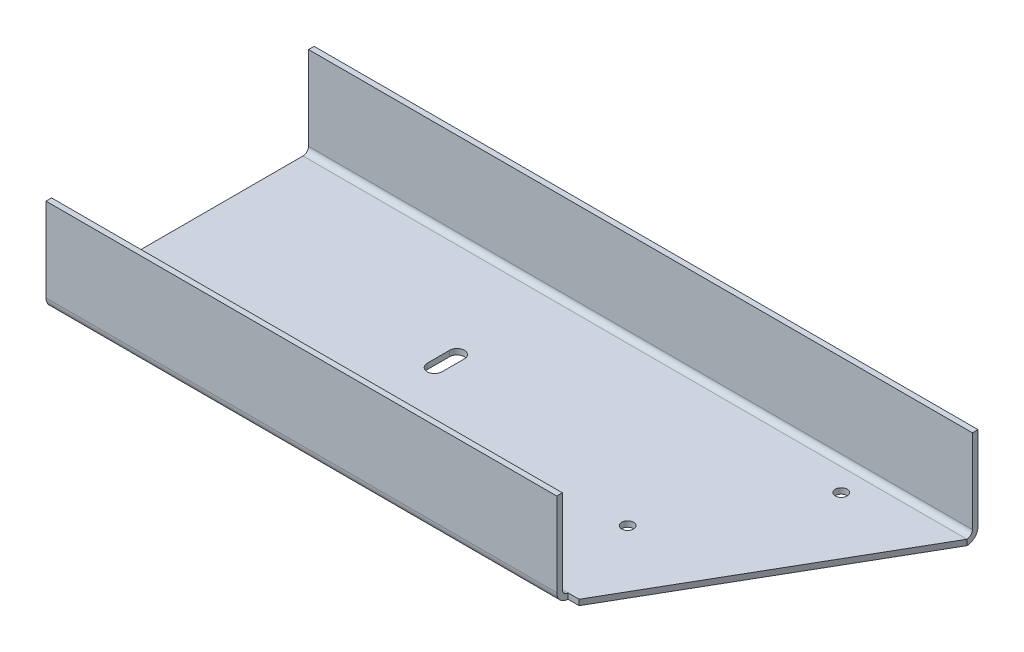
ISO-10303-21;
HEADER;
FILE_DESCRIPTION(('STEP AP214'),'2;1');
FILE_NAME('part.step','',(''),(''),'','','');
FILE_SCHEMA(('AUTOMOTIVE_DESIGN { 1 0 10303 214 1 1 1 1 }'));
ENDSEC;
DATA;
#1=APPLICATION_CONTEXT('core data for automotive mechanical design processes');
#2=APPLICATION_PROTOCOL_DEFINITION('international standard','automotive_design',2000,#1);
#3=PRODUCT_CONTEXT('',#1,'mechanical');
#4=PRODUCT('Part','Part','',(#3));
#5=PRODUCT_RELATED_PRODUCT_CATEGORY('part','',(#4));
#6=PRODUCT_DEFINITION_FORMATION('','',#4);
#7=PRODUCT_DEFINITION_CONTEXT('part definition',#1,'design');
#8=PRODUCT_DEFINITION('design','',#6,#7);
#9=PRODUCT_DEFINITION_SHAPE('','',#8);
#10=(LENGTH_UNIT() NAMED_UNIT(*) SI_UNIT(.MILLI.,.METRE.));
#11=(NAMED_UNIT(*) PLANE_ANGLE_UNIT() SI_UNIT($,.RADIAN.));
#12=(NAMED_UNIT(*) SI_UNIT($,.STERADIAN.) SOLID_ANGLE_UNIT());
#13=UNCERTAINTY_MEASURE_WITH_UNIT(LENGTH_MEASURE(1.E-05),#10,'distance_accuracy_value','');
#14=(GEOMETRIC_REPRESENTATION_CONTEXT(3) GLOBAL_UNCERTAINTY_ASSIGNED_CONTEXT((#13)) GLOBAL_UNIT_ASSIGNED_CONTEXT((#10,
#11,#12)) REPRESENTATION_CONTEXT('',''));
#15=CARTESIAN_POINT('',(0.,0.,0.));
#16=DIRECTION('',(0.,0.,1.));
#17=DIRECTION('',(1.,0.,0.));
#18=AXIS2_PLACEMENT_3D('',#15,#16,#17);
#19=CARTESIAN_POINT('',(733.234841870792,6.35,0.));
#20=DIRECTION('',(0.,0.,1.));
#21=DIRECTION('',(1.,0.,0.));
#22=AXIS2_PLACEMENT_3D('',#19,#20,#21);
#23=PLANE('',#22);
#24=DIRECTION('',(0.,1.,0.));
#25=VECTOR('',#24,1.);
#26=CARTESIAN_POINT('',(355.901016080212,30.1625,0.));
#27=LINE('',#26,#25);
#28=CARTESIAN_POINT('',(355.901016080212,53.975,0.));
#29=VERTEX_POINT('',#28);
#30=CARTESIAN_POINT('',(355.901016080212,6.35,0.));
#31=VERTEX_POINT('',#30);
#32=EDGE_CURVE('E284',#29,#31,#27,.F.);
#33=ORIENTED_EDGE('',*,*,#32,.F.);
#34=DIRECTION('',(1.,0.,0.));
#35=VECTOR('',#34,1.);
#36=CARTESIAN_POINT('',(544.567928975502,53.975,0.));
#37=LINE('',#36,#35);
#38=CARTESIAN_POINT('',(733.234841870792,53.975,0.));
#39=VERTEX_POINT('',#38);
#40=EDGE_CURVE('E148',#29,#39,#37,.T.);
#41=ORIENTED_EDGE('',*,*,#40,.T.);
#42=DIRECTION('',(0.,1.,0.));
#43=VECTOR('',#42,1.);
#44=CARTESIAN_POINT('',(733.234841870792,30.1625,0.));
#45=LINE('',#44,#43);
#46=CARTESIAN_POINT('',(733.234841870792,6.35,0.));
#47=VERTEX_POINT('',#46);
#48=EDGE_CURVE('E274',#39,#47,#45,.F.);
#49=ORIENTED_EDGE('',*,*,#48,.T.);
#50=DIRECTION('',(-1.,0.,0.));
#51=VECTOR('',#50,1.);
#52=CARTESIAN_POINT('',(733.234841870792,6.35,0.));
#53=LINE('',#52,#51);
#54=EDGE_CURVE('E273',#31,#47,#53,.F.);
#55=ORIENTED_EDGE('',*,*,#54,.F.);
#56=EDGE_LOOP('',(#33,#41,#49,#55));
#57=FACE_BOUND('',#56,.T.);
#58=ADVANCED_FACE('F17',(#57),#23,.F.);
#59=CARTESIAN_POINT('',(355.901016080212,6.35,152.4));
#60=DIRECTION('',(0.,0.,-1.));
#61=DIRECTION('',(-1.,0.,0.));
#62=AXIS2_PLACEMENT_3D('',#59,#60,#61);
#63=PLANE('',#62);
#64=DIRECTION('',(0.,1.,0.));
#65=VECTOR('',#64,1.);
#66=CARTESIAN_POINT('',(646.229009265076,30.1625,152.4));
#67=LINE('',#66,#65);
#68=CARTESIAN_POINT('',(646.229009265076,53.975,152.4));
#69=VERTEX_POINT('',#68);
#70=CARTESIAN_POINT('',(646.229009265076,6.35,152.4));
#71=VERTEX_POINT('',#70);
#72=EDGE_CURVE('E169',#69,#71,#67,.F.);
#73=ORIENTED_EDGE('',*,*,#72,.F.);
#74=DIRECTION('',(1.,0.,0.));
#75=VECTOR('',#74,1.);
#76=CARTESIAN_POINT('',(501.065012672644,53.975,152.4));
#77=LINE('',#76,#75);
#78=CARTESIAN_POINT('',(355.901016080212,53.975,152.4));
#79=VERTEX_POINT('',#78);
#80=EDGE_CURVE('E158',#69,#79,#77,.F.);
#81=ORIENTED_EDGE('',*,*,#80,.T.);
#82=DIRECTION('',(0.,1.,0.));
#83=VECTOR('',#82,1.);
#84=CARTESIAN_POINT('',(355.901016080212,30.1625,152.4));
#85=LINE('',#84,#83);
#86=CARTESIAN_POINT('',(355.901016080212,6.35,152.4));
#87=VERTEX_POINT('',#86);
#88=EDGE_CURVE('E138',#79,#87,#85,.F.);
#89=ORIENTED_EDGE('',*,*,#88,.T.);
#90=DIRECTION('',(1.,0.,0.));
#91=VECTOR('',#90,1.);
#92=CARTESIAN_POINT('',(355.901016080212,6.35,152.4));
#93=LINE('',#92,#91);
#94=EDGE_CURVE('E171',#71,#87,#93,.F.);
#95=ORIENTED_EDGE('',*,*,#94,.F.);
#96=EDGE_LOOP('',(#73,#81,#89,#95));
#97=FACE_BOUND('',#96,.T.);
#98=ADVANCED_FACE('F170',(#97),#63,.F.);
#99=CARTESIAN_POINT('',(501.065012672644,53.975,150.8125));
#100=DIRECTION('',(0.,-1.,0.));
#101=DIRECTION('',(0.,0.,-1.));
#102=AXIS2_PLACEMENT_3D('',#99,#100,#101);
#103=PLANE('',#102);
#104=DIRECTION('',(-1.,0.,0.));
#105=VECTOR('',#104,1.);
#106=CARTESIAN_POINT('',(355.901016080212,53.975,149.225));
#107=LINE('',#106,#105);
#108=CARTESIAN_POINT('',(355.901016080212,53.975,149.225));
#109=VERTEX_POINT('',#108);
#110=CARTESIAN_POINT('',(646.229009265076,53.975,149.225));
#111=VERTEX_POINT('',#110);
#112=EDGE_CURVE('E261',#109,#111,#107,.F.);
#113=ORIENTED_EDGE('',*,*,#112,.F.);
#114=DIRECTION('',(0.,0.,-1.));
#115=VECTOR('',#114,1.);
#116=CARTESIAN_POINT('',(355.901016080212,53.975,150.8125));
#117=LINE('',#116,#115);
#118=EDGE_CURVE('E166',#109,#79,#117,.F.);
#119=ORIENTED_EDGE('',*,*,#118,.T.);
#120=ORIENTED_EDGE('',*,*,#80,.F.);
#121=DIRECTION('',(0.,0.,-1.));
#122=VECTOR('',#121,1.);
#123=CARTESIAN_POINT('',(646.229009265076,53.975,150.8125));
#124=LINE('',#123,#122);
#125=EDGE_CURVE('E163',#111,#69,#124,.F.);
#126=ORIENTED_EDGE('',*,*,#125,.F.);
#127=EDGE_LOOP('',(#113,#119,#120,#126));
#128=FACE_BOUND('',#127,.T.);
#129=ADVANCED_FACE('F161',(#128),#103,.F.);
#130=CARTESIAN_POINT('',(544.567928975502,53.975,1.5875));
#131=DIRECTION('',(0.,-1.,0.));
#132=DIRECTION('',(0.,0.,-1.));
#133=AXIS2_PLACEMENT_3D('',#130,#131,#132);
#134=PLANE('',#133);
#135=DIRECTION('',(1.,0.,0.));
#136=VECTOR('',#135,1.);
#137=CARTESIAN_POINT('',(733.234841870792,53.975,3.175));
#138=LINE('',#137,#136);
#139=CARTESIAN_POINT('',(733.234841870792,53.975,3.175));
#140=VERTEX_POINT('',#139);
#141=CARTESIAN_POINT('',(355.901016080212,53.975,3.175));
#142=VERTEX_POINT('',#141);
#143=EDGE_CURVE('E252',#140,#142,#138,.F.);
#144=ORIENTED_EDGE('',*,*,#143,.F.);
#145=DIRECTION('',(0.,0.,1.));
#146=VECTOR('',#145,1.);
#147=CARTESIAN_POINT('',(733.234841870792,53.975,1.5875));
#148=LINE('',#147,#146);
#149=EDGE_CURVE('E271',#140,#39,#148,.F.);
#150=ORIENTED_EDGE('',*,*,#149,.T.);
#151=ORIENTED_EDGE('',*,*,#40,.F.);
#152=DIRECTION('',(0.,0.,1.));
#153=VECTOR('',#152,1.);
#154=CARTESIAN_POINT('',(355.901016080212,53.975,1.5875));
#155=LINE('',#154,#153);
#156=EDGE_CURVE('E192',#142,#29,#155,.F.);
#157=ORIENTED_EDGE('',*,*,#156,.F.);
#158=EDGE_LOOP('',(#144,#150,#151,#157));
#159=FACE_BOUND('',#158,.T.);
#160=ADVANCED_FACE('F637',(#159),#134,.F.);
#161=CARTESIAN_POINT('',(733.234841870792,6.35,6.35));
#162=DIRECTION('',(-1.,0.,0.));
#163=DIRECTION('',(0.,0.,1.));
#164=AXIS2_PLACEMENT_3D('',#161,#162,#163);
#165=CYLINDRICAL_SURFACE('',#164,6.35);
#166=ORIENTED_EDGE('',*,*,#54,.T.);
#167=CARTESIAN_POINT('',(733.234841870792,6.35,6.35));
#168=DIRECTION('',(-1.,0.,0.));
#169=DIRECTION('',(0.,0.,1.));
#170=AXIS2_PLACEMENT_3D('',#167,#168,#169);
#171=CIRCLE('',#170,6.35);
#172=CARTESIAN_POINT('',(733.234841870826,0.,6.35000000002225));
#173=VERTEX_POINT('',#172);
#174=EDGE_CURVE('E253',#47,#173,#171,.T.);
#175=ORIENTED_EDGE('',*,*,#174,.T.);
#176=DIRECTION('',(1.,0.,0.));
#177=VECTOR('',#176,1.);
#178=CARTESIAN_POINT('',(0.,0.,6.35000000000762));
#179=LINE('',#178,#177);
#180=CARTESIAN_POINT('',(355.901016080212,0.,6.35000000000381));
#181=VERTEX_POINT('',#180);
#182=EDGE_CURVE('E314',#173,#181,#179,.F.);
#183=ORIENTED_EDGE('',*,*,#182,.T.);
#184=CARTESIAN_POINT('',(355.901016080212,6.35,6.35));
#185=DIRECTION('',(-1.,0.,0.));
#186=DIRECTION('',(0.,0.,1.));
#187=AXIS2_PLACEMENT_3D('',#184,#185,#186);
#188=CIRCLE('',#187,6.35);
#189=EDGE_CURVE('E249',#31,#181,#188,.T.);
#190=ORIENTED_EDGE('',*,*,#189,.F.);
#191=EDGE_LOOP('',(#166,#175,#183,#190));
#192=FACE_BOUND('',#191,.T.);
#193=ADVANCED_FACE('F319',(#192),#165,.T.);
#194=CARTESIAN_POINT('',(355.901016080212,6.35,146.05));
#195=DIRECTION('',(1.,0.,0.));
#196=DIRECTION('',(0.,0.,-1.));
#197=AXIS2_PLACEMENT_3D('',#194,#195,#196);
#198=CYLINDRICAL_SURFACE('',#197,6.35);
#199=ORIENTED_EDGE('',*,*,#94,.T.);
#200=CARTESIAN_POINT('',(355.901016080212,6.35,146.05));
#201=DIRECTION('',(1.,0.,0.));
#202=DIRECTION('',(0.,0.,-1.));
#203=AXIS2_PLACEMENT_3D('',#200,#201,#202);
#204=CIRCLE('',#203,6.35);
#205=CARTESIAN_POINT('',(355.901016080212,0.,146.05));
#206=VERTEX_POINT('',#205);
#207=EDGE_CURVE('E20',#87,#206,#204,.T.);
#208=ORIENTED_EDGE('',*,*,#207,.T.);
#209=DIRECTION('',(1.,0.,0.));
#210=VECTOR('',#209,1.);
#211=CARTESIAN_POINT('',(0.,0.,146.05));
#212=LINE('',#211,#210);
#213=CARTESIAN_POINT('',(646.229009265076,0.,146.05));
#214=VERTEX_POINT('',#213);
#215=EDGE_CURVE('E270',#206,#214,#212,.T.);
#216=ORIENTED_EDGE('',*,*,#215,.T.);
#217=CARTESIAN_POINT('',(646.229009265076,6.35,146.05));
#218=DIRECTION('',(1.,0.,0.));
#219=DIRECTION('',(0.,0.,-1.));
#220=AXIS2_PLACEMENT_3D('',#217,#218,#219);
#221=CIRCLE('',#220,6.35);
#222=EDGE_CURVE('E254',#71,#214,#221,.T.);
#223=ORIENTED_EDGE('',*,*,#222,.F.);
#224=EDGE_LOOP('',(#199,#208,#216,#223));
#225=FACE_BOUND('',#224,.T.);
#226=ADVANCED_FACE('F304',(#225),#198,.T.);
#227=CARTESIAN_POINT('',(355.901016080212,6.35,149.225));
#228=DIRECTION('',(0.,0.,-1.));
#229=DIRECTION('',(-1.,0.,0.));
#230=AXIS2_PLACEMENT_3D('',#227,#228,#229);
#231=PLANE('',#230);
#232=DIRECTION('',(1.,0.,0.));
#233=VECTOR('',#232,1.);
#234=CARTESIAN_POINT('',(355.901016080212,6.35,149.225));
#235=LINE('',#234,#233);
#236=CARTESIAN_POINT('',(646.229009265076,6.35,149.225));
#237=VERTEX_POINT('',#236);
#238=CARTESIAN_POINT('',(355.901016080212,6.35,149.225));
#239=VERTEX_POINT('',#238);
#240=EDGE_CURVE('E245',#237,#239,#235,.F.);
#241=ORIENTED_EDGE('',*,*,#240,.T.);
#242=DIRECTION('',(0.,1.,0.));
#243=VECTOR('',#242,1.);
#244=CARTESIAN_POINT('',(355.901016080212,6.35,149.225));
#245=LINE('',#244,#243);
#246=EDGE_CURVE('E255',#239,#109,#245,.T.);
#247=ORIENTED_EDGE('',*,*,#246,.T.);
#248=ORIENTED_EDGE('',*,*,#112,.T.);
#249=DIRECTION('',(0.,1.,0.));
#250=VECTOR('',#249,1.);
#251=CARTESIAN_POINT('',(646.229009265076,6.35,149.225));
#252=LINE('',#251,#250);
#253=EDGE_CURVE('E178',#111,#237,#252,.F.);
#254=ORIENTED_EDGE('',*,*,#253,.T.);
#255=EDGE_LOOP('',(#241,#247,#248,#254));
#256=FACE_BOUND('',#255,.T.);
#257=ADVANCED_FACE('F615',(#256),#231,.T.);
#258=CARTESIAN_POINT('',(646.229009265076,2.9824039545985,149.417596045414));
#259=DIRECTION('',(1.,0.,0.));
#260=DIRECTION('',(0.,0.,-1.));
#261=AXIS2_PLACEMENT_3D('',#258,#259,#260);
#262=PLANE('',#261);
#263=CARTESIAN_POINT('',(646.229009265076,6.35,146.05));
#264=DIRECTION('',(1.,0.,0.));
#265=DIRECTION('',(0.,0.,-1.));
#266=AXIS2_PLACEMENT_3D('',#263,#264,#265);
#267=CIRCLE('',#266,3.175);
#268=CARTESIAN_POINT('',(646.229009265076,3.175,146.05));
#269=VERTEX_POINT('',#268);
#270=EDGE_CURVE('E243',#269,#237,#267,.F.);
#271=ORIENTED_EDGE('',*,*,#270,.T.);
#272=ORIENTED_EDGE('',*,*,#253,.F.);
#273=ORIENTED_EDGE('',*,*,#125,.T.);
#274=ORIENTED_EDGE('',*,*,#72,.T.);
#275=ORIENTED_EDGE('',*,*,#222,.T.);
#276=DIRECTION('',(0.,1.,0.));
#277=VECTOR('',#276,1.);
#278=CARTESIAN_POINT('',(646.229009265076,1.5875,146.05));
#279=LINE('',#278,#277);
#280=EDGE_CURVE('E334',#214,#269,#279,.T.);
#281=ORIENTED_EDGE('',*,*,#280,.T.);
#282=EDGE_LOOP('',(#271,#272,#273,#274,#275,#281));
#283=FACE_BOUND('',#282,.T.);
#284=ADVANCED_FACE('F176',(#283),#262,.T.);
#285=CARTESIAN_POINT('',(733.234841870792,2.9824039545985,2.9824039545985));
#286=DIRECTION('',(-1.,0.,0.));
#287=DIRECTION('',(0.,0.,1.));
#288=AXIS2_PLACEMENT_3D('',#285,#286,#287);
#289=PLANE('',#288);
#290=CARTESIAN_POINT('',(733.234841870792,6.35,6.35));
#291=DIRECTION('',(-1.,0.,0.));
#292=DIRECTION('',(0.,0.,1.));
#293=AXIS2_PLACEMENT_3D('',#290,#291,#292);
#294=CIRCLE('',#293,3.175);
#295=CARTESIAN_POINT('',(733.234841870792,6.35,3.175));
#296=VERTEX_POINT('',#295);
#297=CARTESIAN_POINT('',(733.234841870817,3.175,6.35000000001493));
#298=VERTEX_POINT('',#297);
#299=EDGE_CURVE('E240',#296,#298,#294,.T.);
#300=ORIENTED_EDGE('',*,*,#299,.T.);
#301=DIRECTION('',(0.,1.,0.));
#302=VECTOR('',#301,1.);
#303=CARTESIAN_POINT('',(733.234841870843,1.5875,6.35000000003687));
#304=LINE('',#303,#302);
#305=EDGE_CURVE('E333',#298,#173,#304,.F.);
#306=ORIENTED_EDGE('',*,*,#305,.T.);
#307=ORIENTED_EDGE('',*,*,#174,.F.);
#308=ORIENTED_EDGE('',*,*,#48,.F.);
#309=ORIENTED_EDGE('',*,*,#149,.F.);
#310=DIRECTION('',(0.,1.,0.));
#311=VECTOR('',#310,1.);
#312=CARTESIAN_POINT('',(733.234841870792,6.35,3.175));
#313=LINE('',#312,#311);
#314=EDGE_CURVE('E323',#296,#140,#313,.T.);
#315=ORIENTED_EDGE('',*,*,#314,.F.);
#316=EDGE_LOOP('',(#300,#306,#307,#308,#309,#315));
#317=FACE_BOUND('',#316,.T.);
#318=ADVANCED_FACE('F366',(#317),#289,.F.);
#319=CARTESIAN_POINT('',(733.234841870792,6.35,3.175));
#320=DIRECTION('',(0.,0.,1.));
#321=DIRECTION('',(1.,0.,0.));
#322=AXIS2_PLACEMENT_3D('',#319,#320,#321);
#323=PLANE('',#322);
#324=DIRECTION('',(-1.,0.,0.));
#325=VECTOR('',#324,1.);
#326=CARTESIAN_POINT('',(733.234841870792,6.35,3.175));
#327=LINE('',#326,#325);
#328=CARTESIAN_POINT('',(355.901016080212,6.35,3.175));
#329=VERTEX_POINT('',#328);
#330=EDGE_CURVE('E237',#329,#296,#327,.F.);
#331=ORIENTED_EDGE('',*,*,#330,.T.);
#332=ORIENTED_EDGE('',*,*,#314,.T.);
#333=ORIENTED_EDGE('',*,*,#143,.T.);
#334=DIRECTION('',(0.,1.,0.));
#335=VECTOR('',#334,1.);
#336=CARTESIAN_POINT('',(355.901016080212,6.35,3.175));
#337=LINE('',#336,#335);
#338=EDGE_CURVE('E279',#142,#329,#337,.F.);
#339=ORIENTED_EDGE('',*,*,#338,.T.);
#340=EDGE_LOOP('',(#331,#332,#333,#339));
#341=FACE_BOUND('',#340,.T.);
#342=ADVANCED_FACE('F445',(#341),#323,.T.);
#343=CARTESIAN_POINT('',(0.,0.,0.));
#344=DIRECTION('',(0.,1.,0.));
#345=DIRECTION('',(0.,0.,1.));
#346=AXIS2_PLACEMENT_3D('',#343,#344,#345);
#347=PLANE('',#346);
#348=CARTESIAN_POINT('',(497.4336,0.,120.65));
#349=DIRECTION('',(0.,1.,0.));
#350=DIRECTION('',(0.,0.,1.));
#351=AXIS2_PLACEMENT_3D('',#348,#349,#350);
#352=CIRCLE('',#351,4.2164);
#353=CARTESIAN_POINT('',(493.2172,0.,120.65));
#354=VERTEX_POINT('',#353);
#355=CARTESIAN_POINT('',(501.65,0.,120.65));
#356=VERTEX_POINT('',#355);
#357=EDGE_CURVE('E227',#354,#356,#352,.T.);
#358=ORIENTED_EDGE('',*,*,#357,.T.);
#359=DIRECTION('',(0.,0.,-1.));
#360=VECTOR('',#359,1.);
#361=CARTESIAN_POINT('',(501.65,0.,114.3));
#362=LINE('',#361,#360);
#363=CARTESIAN_POINT('',(501.65,0.,107.95));
#364=VERTEX_POINT('',#363);
#365=EDGE_CURVE('E230',#356,#364,#362,.T.);
#366=ORIENTED_EDGE('',*,*,#365,.T.);
#367=CARTESIAN_POINT('',(497.4336,0.,107.95));
#368=DIRECTION('',(0.,1.,0.));
#369=DIRECTION('',(0.,0.,1.));
#370=AXIS2_PLACEMENT_3D('',#367,#368,#369);
#371=CIRCLE('',#370,4.2164);
#372=CARTESIAN_POINT('',(493.2172,0.,107.95));
#373=VERTEX_POINT('',#372);
#374=EDGE_CURVE('E223',#364,#373,#371,.T.);
#375=ORIENTED_EDGE('',*,*,#374,.T.);
#376=DIRECTION('',(0.,0.,1.));
#377=VECTOR('',#376,1.);
#378=CARTESIAN_POINT('',(493.2172,0.,114.3));
#379=LINE('',#378,#377);
#380=EDGE_CURVE('E354',#373,#354,#379,.T.);
#381=ORIENTED_EDGE('',*,*,#380,.T.);
#382=EDGE_LOOP('',(#358,#366,#375,#381));
#383=FACE_BOUND('',#382,.T.);
#384=CARTESIAN_POINT('',(497.4336,0.,73.025));
#385=DIRECTION('',(0.,1.,0.));
#386=DIRECTION('',(0.,0.,1.));
#387=AXIS2_PLACEMENT_3D('',#384,#385,#386);
#388=CIRCLE('',#387,4.2164);
#389=CARTESIAN_POINT('',(493.2172,0.,73.025));
#390=VERTEX_POINT('',#389);
#391=CARTESIAN_POINT('',(501.65,0.,73.025));
#392=VERTEX_POINT('',#391);
#393=EDGE_CURVE('E219',#390,#392,#388,.T.);
#394=ORIENTED_EDGE('',*,*,#393,.T.);
#395=DIRECTION('',(0.,0.,-1.));
#396=VECTOR('',#395,1.);
#397=CARTESIAN_POINT('',(501.65,0.,66.675));
#398=LINE('',#397,#396);
#399=CARTESIAN_POINT('',(501.65,0.,60.325));
#400=VERTEX_POINT('',#399);
#401=EDGE_CURVE('E222',#392,#400,#398,.T.);
#402=ORIENTED_EDGE('',*,*,#401,.T.);
#403=CARTESIAN_POINT('',(497.4336,0.,60.325));
#404=DIRECTION('',(0.,1.,0.));
#405=DIRECTION('',(0.,0.,1.));
#406=AXIS2_PLACEMENT_3D('',#403,#404,#405);
#407=CIRCLE('',#406,4.2164);
#408=CARTESIAN_POINT('',(493.2172,0.,60.325));
#409=VERTEX_POINT('',#408);
#410=EDGE_CURVE('E216',#400,#409,#407,.T.);
#411=ORIENTED_EDGE('',*,*,#410,.T.);
#412=DIRECTION('',(0.,0.,1.));
#413=VECTOR('',#412,1.);
#414=CARTESIAN_POINT('',(493.2172,0.,66.675));
#415=LINE('',#414,#413);
#416=EDGE_CURVE('E391',#409,#390,#415,.T.);
#417=ORIENTED_EDGE('',*,*,#416,.T.);
#418=EDGE_LOOP('',(#394,#402,#411,#417));
#419=FACE_BOUND('',#418,.T.);
#420=CARTESIAN_POINT('',(630.126054521088,0.,96.0396583964484));
#421=DIRECTION('',(0.,1.,0.));
#422=DIRECTION('',(0.,0.,1.));
#423=AXIS2_PLACEMENT_3D('',#420,#421,#422);
#424=CIRCLE('',#423,3.3655);
#425=CARTESIAN_POINT('',(630.126054521088,0.,99.4051583964484));
#426=VERTEX_POINT('',#425);
#427=EDGE_CURVE('E234',#426,#426,#424,.T.);
#428=ORIENTED_EDGE('',*,*,#427,.T.);
#429=EDGE_LOOP('',(#428));
#430=FACE_BOUND('',#429,.T.);
#431=CARTESIAN_POINT('',(674.576054521088,0.,19.05));
#432=DIRECTION('',(0.,1.,0.));
#433=DIRECTION('',(0.,0.,1.));
#434=AXIS2_PLACEMENT_3D('',#431,#432,#433);
#435=CIRCLE('',#434,3.3655);
#436=CARTESIAN_POINT('',(674.576054521088,0.,22.4155));
#437=VERTEX_POINT('',#436);
#438=EDGE_CURVE('E231',#437,#437,#435,.T.);
#439=ORIENTED_EDGE('',*,*,#438,.T.);
#440=EDGE_LOOP('',(#439));
#441=FACE_BOUND('',#440,.T.);
#442=DIRECTION('',(-1.,0.,0.));
#443=VECTOR('',#442,1.);
#444=CARTESIAN_POINT('',(649.404009265076,0.,146.05));
#445=LINE('',#444,#443);
#446=CARTESIAN_POINT('',(652.579009265075,0.,146.049999999999));
#447=VERTEX_POINT('',#446);
#448=EDGE_CURVE('E312',#447,#214,#445,.T.);
#449=ORIENTED_EDGE('',*,*,#448,.T.);
#450=ORIENTED_EDGE('',*,*,#215,.F.);
#451=DIRECTION('',(0.,0.,-1.));
#452=VECTOR('',#451,1.);
#453=CARTESIAN_POINT('',(355.901016080212,0.,76.2));
#454=LINE('',#453,#452);
#455=EDGE_CURVE('E248',#206,#181,#454,.T.);
#456=ORIENTED_EDGE('',*,*,#455,.T.);
#457=ORIENTED_EDGE('',*,*,#182,.F.);
#458=DIRECTION('',(-0.500000000000017,0.,0.866025403784429));
#459=VECTOR('',#458,1.);
#460=CARTESIAN_POINT('',(694.740012672644,0.,73.025));
#461=LINE('',#460,#459);
#462=EDGE_CURVE('E331',#173,#447,#461,.T.);
#463=ORIENTED_EDGE('',*,*,#462,.T.);
#464=EDGE_LOOP('',(#449,#450,#456,#457,#463));
#465=FACE_BOUND('',#464,.T.);
#466=ADVANCED_FACE('F308',(#383,#419,#430,#441,#465),#347,.F.);
#467=CARTESIAN_POINT('',(355.901016080212,1.5875,76.2));
#468=DIRECTION('',(1.,0.,0.));
#469=DIRECTION('',(0.,0.,-1.));
#470=AXIS2_PLACEMENT_3D('',#467,#468,#469);
#471=PLANE('',#470);
#472=ORIENTED_EDGE('',*,*,#455,.F.);
#473=ORIENTED_EDGE('',*,*,#207,.F.);
#474=ORIENTED_EDGE('',*,*,#88,.F.);
#475=ORIENTED_EDGE('',*,*,#118,.F.);
#476=ORIENTED_EDGE('',*,*,#246,.F.);
#477=CARTESIAN_POINT('',(355.901016080212,6.35,146.05));
#478=DIRECTION('',(1.,0.,0.));
#479=DIRECTION('',(0.,0.,-1.));
#480=AXIS2_PLACEMENT_3D('',#477,#478,#479);
#481=CIRCLE('',#480,3.175);
#482=CARTESIAN_POINT('',(355.901016080212,3.175,146.05));
#483=VERTEX_POINT('',#482);
#484=EDGE_CURVE('E246',#239,#483,#481,.T.);
#485=ORIENTED_EDGE('',*,*,#484,.T.);
#486=DIRECTION('',(0.,0.,1.));
#487=VECTOR('',#486,1.);
#488=CARTESIAN_POINT('',(355.901016080212,3.175,0.));
#489=LINE('',#488,#487);
#490=CARTESIAN_POINT('',(355.901016080212,3.175,6.35000000000381));
#491=VERTEX_POINT('',#490);
#492=EDGE_CURVE('E342',#491,#483,#489,.T.);
#493=ORIENTED_EDGE('',*,*,#492,.F.);
#494=CARTESIAN_POINT('',(355.901016080212,6.35,6.35));
#495=DIRECTION('',(-1.,0.,0.));
#496=DIRECTION('',(0.,0.,1.));
#497=AXIS2_PLACEMENT_3D('',#494,#495,#496);
#498=CIRCLE('',#497,3.175);
#499=EDGE_CURVE('E238',#491,#329,#498,.F.);
#500=ORIENTED_EDGE('',*,*,#499,.T.);
#501=ORIENTED_EDGE('',*,*,#338,.F.);
#502=ORIENTED_EDGE('',*,*,#156,.T.);
#503=ORIENTED_EDGE('',*,*,#32,.T.);
#504=ORIENTED_EDGE('',*,*,#189,.T.);
#505=EDGE_LOOP('',(#472,#473,#474,#475,#476,#485,#493,#500,#501,#502,#503,#504));
#506=FACE_BOUND('',#505,.T.);
#507=ADVANCED_FACE('F316',(#506),#471,.F.);
#508=CARTESIAN_POINT('',(355.901016080212,6.35,146.05));
#509=DIRECTION('',(1.,0.,0.));
#510=DIRECTION('',(0.,0.,-1.));
#511=AXIS2_PLACEMENT_3D('',#508,#509,#510);
#512=CYLINDRICAL_SURFACE('',#511,3.175);
#513=ORIENTED_EDGE('',*,*,#270,.F.);
#514=DIRECTION('',(1.,0.,0.));
#515=VECTOR('',#514,1.);
#516=CARTESIAN_POINT('',(0.,3.175,146.05));
#517=LINE('',#516,#515);
#518=EDGE_CURVE('E340',#483,#269,#517,.T.);
#519=ORIENTED_EDGE('',*,*,#518,.F.);
#520=ORIENTED_EDGE('',*,*,#484,.F.);
#521=ORIENTED_EDGE('',*,*,#240,.F.);
#522=EDGE_LOOP('',(#513,#519,#520,#521));
#523=FACE_BOUND('',#522,.T.);
#524=ADVANCED_FACE('F572',(#523),#512,.F.);
#525=CARTESIAN_POINT('',(649.404009265076,1.5875,146.05));
#526=DIRECTION('',(0.,0.,-1.));
#527=DIRECTION('',(-1.,0.,0.));
#528=AXIS2_PLACEMENT_3D('',#525,#526,#527);
#529=PLANE('',#528);
#530=DIRECTION('',(0.,1.,0.));
#531=VECTOR('',#530,1.);
#532=CARTESIAN_POINT('',(652.579009265071,1.5875,146.049999999997));
#533=LINE('',#532,#531);
#534=CARTESIAN_POINT('',(652.579009265075,3.175,146.049999999999));
#535=VERTEX_POINT('',#534);
#536=EDGE_CURVE('E242',#447,#535,#533,.T.);
#537=ORIENTED_EDGE('',*,*,#536,.T.);
#538=DIRECTION('',(1.,0.,0.));
#539=VECTOR('',#538,1.);
#540=CARTESIAN_POINT('',(0.,3.175,146.05));
#541=LINE('',#540,#539);
#542=EDGE_CURVE('E337',#269,#535,#541,.T.);
#543=ORIENTED_EDGE('',*,*,#542,.F.);
#544=ORIENTED_EDGE('',*,*,#280,.F.);
#545=ORIENTED_EDGE('',*,*,#448,.F.);
#546=EDGE_LOOP('',(#537,#543,#544,#545));
#547=FACE_BOUND('',#546,.T.);
#548=ADVANCED_FACE('F384',(#547),#529,.F.);
#549=CARTESIAN_POINT('',(694.740012672644,1.5875,73.025));
#550=DIRECTION('',(-0.866025403784429,0.,-0.500000000000017));
#551=DIRECTION('',(-0.500000000000017,0.,0.866025403784429));
#552=AXIS2_PLACEMENT_3D('',#549,#550,#551);
#553=PLANE('',#552);
#554=ORIENTED_EDGE('',*,*,#536,.F.);
#555=ORIENTED_EDGE('',*,*,#462,.F.);
#556=ORIENTED_EDGE('',*,*,#305,.F.);
#557=DIRECTION('',(0.499999999999673,0.,-0.866025403784627));
#558=VECTOR('',#557,1.);
#559=CARTESIAN_POINT('',(652.579009265076,3.175,146.05));
#560=LINE('',#559,#558);
#561=EDGE_CURVE('E329',#535,#298,#560,.T.);
#562=ORIENTED_EDGE('',*,*,#561,.F.);
#563=EDGE_LOOP('',(#554,#555,#556,#562));
#564=FACE_BOUND('',#563,.T.);
#565=ADVANCED_FACE('F373',(#564),#553,.F.);
#566=CARTESIAN_POINT('',(733.234841870792,6.35,6.35));
#567=DIRECTION('',(-1.,0.,0.));
#568=DIRECTION('',(0.,0.,1.));
#569=AXIS2_PLACEMENT_3D('',#566,#567,#568);
#570=CYLINDRICAL_SURFACE('',#569,3.175);
#571=ORIENTED_EDGE('',*,*,#499,.F.);
#572=DIRECTION('',(1.,0.,0.));
#573=VECTOR('',#572,1.);
#574=CARTESIAN_POINT('',(0.,3.175,6.35000000000762));
#575=LINE('',#574,#573);
#576=EDGE_CURVE('E215',#298,#491,#575,.F.);
#577=ORIENTED_EDGE('',*,*,#576,.F.);
#578=ORIENTED_EDGE('',*,*,#299,.F.);
#579=ORIENTED_EDGE('',*,*,#330,.F.);
#580=EDGE_LOOP('',(#571,#577,#578,#579));
#581=FACE_BOUND('',#580,.T.);
#582=ADVANCED_FACE('F377',(#581),#570,.F.);
#583=CARTESIAN_POINT('',(630.126054521088,1.5875,96.0396583964484));
#584=DIRECTION('',(0.,1.,0.));
#585=DIRECTION('',(0.,0.,1.));
#586=AXIS2_PLACEMENT_3D('',#583,#584,#585);
#587=CYLINDRICAL_SURFACE('',#586,3.3655);
#588=CARTESIAN_POINT('',(630.126054521088,3.175,96.0396583964484));
#589=DIRECTION('',(0.,1.,0.));
#590=DIRECTION('',(0.,0.,1.));
#591=AXIS2_PLACEMENT_3D('',#588,#589,#590);
#592=CIRCLE('',#591,3.3655);
#593=CARTESIAN_POINT('',(630.126054521088,3.175,99.4051583964484));
#594=VERTEX_POINT('',#593);
#595=EDGE_CURVE('E212',#594,#594,#592,.F.);
#596=ORIENTED_EDGE('',*,*,#595,.F.);
#597=EDGE_LOOP('',(#596));
#598=FACE_BOUND('',#597,.T.);
#599=ORIENTED_EDGE('',*,*,#427,.F.);
#600=EDGE_LOOP('',(#599));
#601=FACE_BOUND('',#600,.T.);
#602=ADVANCED_FACE('F453',(#598,#601),#587,.F.);
#603=CARTESIAN_POINT('',(674.576054521088,1.5875,19.05));
#604=DIRECTION('',(0.,1.,0.));
#605=DIRECTION('',(0.,0.,1.));
#606=AXIS2_PLACEMENT_3D('',#603,#604,#605);
#607=CYLINDRICAL_SURFACE('',#606,3.3655);
#608=CARTESIAN_POINT('',(674.576054521088,3.175,19.05));
#609=DIRECTION('',(0.,1.,0.));
#610=DIRECTION('',(0.,0.,1.));
#611=AXIS2_PLACEMENT_3D('',#608,#609,#610);
#612=CIRCLE('',#611,3.3655);
#613=CARTESIAN_POINT('',(674.576054521088,3.175,22.4155));
#614=VERTEX_POINT('',#613);
#615=EDGE_CURVE('E209',#614,#614,#612,.F.);
#616=ORIENTED_EDGE('',*,*,#615,.F.);
#617=EDGE_LOOP('',(#616));
#618=FACE_BOUND('',#617,.T.);
#619=ORIENTED_EDGE('',*,*,#438,.F.);
#620=EDGE_LOOP('',(#619));
#621=FACE_BOUND('',#620,.T.);
#622=ADVANCED_FACE('F451',(#618,#621),#607,.F.);
#623=CARTESIAN_POINT('',(501.65,1.5875,114.3));
#624=DIRECTION('',(1.,0.,0.));
#625=DIRECTION('',(0.,0.,-1.));
#626=AXIS2_PLACEMENT_3D('',#623,#624,#625);
#627=PLANE('',#626);
#628=DIRECTION('',(0.,0.,1.));
#629=VECTOR('',#628,1.);
#630=CARTESIAN_POINT('',(501.65,3.175,0.));
#631=LINE('',#630,#629);
#632=CARTESIAN_POINT('',(501.65,3.175,107.95));
#633=VERTEX_POINT('',#632);
#634=CARTESIAN_POINT('',(501.65,3.175,120.65));
#635=VERTEX_POINT('',#634);
#636=EDGE_CURVE('E208',#633,#635,#631,.T.);
#637=ORIENTED_EDGE('',*,*,#636,.F.);
#638=DIRECTION('',(0.,1.,0.));
#639=VECTOR('',#638,1.);
#640=CARTESIAN_POINT('',(501.65,1.5875,107.95));
#641=LINE('',#640,#639);
#642=EDGE_CURVE('E390',#633,#364,#641,.F.);
#643=ORIENTED_EDGE('',*,*,#642,.T.);
#644=ORIENTED_EDGE('',*,*,#365,.F.);
#645=DIRECTION('',(0.,1.,0.));
#646=VECTOR('',#645,1.);
#647=CARTESIAN_POINT('',(501.65,1.5875,120.65));
#648=LINE('',#647,#646);
#649=EDGE_CURVE('E229',#356,#635,#648,.T.);
#650=ORIENTED_EDGE('',*,*,#649,.T.);
#651=EDGE_LOOP('',(#637,#643,#644,#650));
#652=FACE_BOUND('',#651,.T.);
#653=ADVANCED_FACE('F402',(#652),#627,.F.);
#654=CARTESIAN_POINT('',(497.4336,1.5875,120.65));
#655=DIRECTION('',(0.,1.,0.));
#656=DIRECTION('',(0.,0.,1.));
#657=AXIS2_PLACEMENT_3D('',#654,#655,#656);
#658=CYLINDRICAL_SURFACE('',#657,4.2164);
#659=CARTESIAN_POINT('',(497.4336,3.175,120.65));
#660=DIRECTION('',(0.,1.,0.));
#661=DIRECTION('',(0.,0.,1.));
#662=AXIS2_PLACEMENT_3D('',#659,#660,#661);
#663=CIRCLE('',#662,4.2164);
#664=CARTESIAN_POINT('',(493.2172,3.175,120.65));
#665=VERTEX_POINT('',#664);
#666=EDGE_CURVE('E205',#635,#665,#663,.F.);
#667=ORIENTED_EDGE('',*,*,#666,.F.);
#668=ORIENTED_EDGE('',*,*,#649,.F.);
#669=ORIENTED_EDGE('',*,*,#357,.F.);
#670=DIRECTION('',(0.,1.,0.));
#671=VECTOR('',#670,1.);
#672=CARTESIAN_POINT('',(493.2172,1.5875,120.65));
#673=LINE('',#672,#671);
#674=EDGE_CURVE('E226',#354,#665,#673,.T.);
#675=ORIENTED_EDGE('',*,*,#674,.T.);
#676=EDGE_LOOP('',(#667,#668,#669,#675));
#677=FACE_BOUND('',#676,.T.);
#678=ADVANCED_FACE('F418',(#677),#658,.F.);
#679=CARTESIAN_POINT('',(493.2172,1.5875,114.3));
#680=DIRECTION('',(-1.,0.,0.));
#681=DIRECTION('',(0.,0.,1.));
#682=AXIS2_PLACEMENT_3D('',#679,#680,#681);
#683=PLANE('',#682);
#684=DIRECTION('',(0.,0.,1.));
#685=VECTOR('',#684,1.);
#686=CARTESIAN_POINT('',(493.2172,3.175,0.));
#687=LINE('',#686,#685);
#688=CARTESIAN_POINT('',(493.2172,3.175,107.95));
#689=VERTEX_POINT('',#688);
#690=EDGE_CURVE('E204',#665,#689,#687,.F.);
#691=ORIENTED_EDGE('',*,*,#690,.F.);
#692=ORIENTED_EDGE('',*,*,#674,.F.);
#693=ORIENTED_EDGE('',*,*,#380,.F.);
#694=DIRECTION('',(0.,1.,0.));
#695=VECTOR('',#694,1.);
#696=CARTESIAN_POINT('',(493.2172,1.5875,107.95));
#697=LINE('',#696,#695);
#698=EDGE_CURVE('E225',#373,#689,#697,.T.);
#699=ORIENTED_EDGE('',*,*,#698,.T.);
#700=EDGE_LOOP('',(#691,#692,#693,#699));
#701=FACE_BOUND('',#700,.T.);
#702=ADVANCED_FACE('F480',(#701),#683,.F.);
#703=CARTESIAN_POINT('',(497.4336,1.5875,107.95));
#704=DIRECTION('',(0.,1.,0.));
#705=DIRECTION('',(0.,0.,1.));
#706=AXIS2_PLACEMENT_3D('',#703,#704,#705);
#707=CYLINDRICAL_SURFACE('',#706,4.2164);
#708=CARTESIAN_POINT('',(497.4336,3.175,107.95));
#709=DIRECTION('',(0.,1.,0.));
#710=DIRECTION('',(0.,0.,1.));
#711=AXIS2_PLACEMENT_3D('',#708,#709,#710);
#712=CIRCLE('',#711,4.2164);
#713=EDGE_CURVE('E201',#689,#633,#712,.F.);
#714=ORIENTED_EDGE('',*,*,#713,.F.);
#715=ORIENTED_EDGE('',*,*,#698,.F.);
#716=ORIENTED_EDGE('',*,*,#374,.F.);
#717=ORIENTED_EDGE('',*,*,#642,.F.);
#718=EDGE_LOOP('',(#714,#715,#716,#717));
#719=FACE_BOUND('',#718,.T.);
#720=ADVANCED_FACE('F408',(#719),#707,.F.);
#721=CARTESIAN_POINT('',(501.65,1.5875,66.675));
#722=DIRECTION('',(1.,0.,0.));
#723=DIRECTION('',(0.,0.,-1.));
#724=AXIS2_PLACEMENT_3D('',#721,#722,#723);
#725=PLANE('',#724);
#726=DIRECTION('',(0.,0.,1.));
#727=VECTOR('',#726,1.);
#728=CARTESIAN_POINT('',(501.65,3.175,0.));
#729=LINE('',#728,#727);
#730=CARTESIAN_POINT('',(501.65,3.175,60.325));
#731=VERTEX_POINT('',#730);
#732=CARTESIAN_POINT('',(501.65,3.175,73.025));
#733=VERTEX_POINT('',#732);
#734=EDGE_CURVE('E200',#731,#733,#729,.T.);
#735=ORIENTED_EDGE('',*,*,#734,.F.);
#736=DIRECTION('',(0.,1.,0.));
#737=VECTOR('',#736,1.);
#738=CARTESIAN_POINT('',(501.65,1.5875,60.325));
#739=LINE('',#738,#737);
#740=EDGE_CURVE('E347',#731,#400,#739,.F.);
#741=ORIENTED_EDGE('',*,*,#740,.T.);
#742=ORIENTED_EDGE('',*,*,#401,.F.);
#743=DIRECTION('',(0.,1.,0.));
#744=VECTOR('',#743,1.);
#745=CARTESIAN_POINT('',(501.65,1.5875,73.025));
#746=LINE('',#745,#744);
#747=EDGE_CURVE('E221',#392,#733,#746,.T.);
#748=ORIENTED_EDGE('',*,*,#747,.T.);
#749=EDGE_LOOP('',(#735,#741,#742,#748));
#750=FACE_BOUND('',#749,.T.);
#751=ADVANCED_FACE('F438',(#750),#725,.F.);
#752=CARTESIAN_POINT('',(497.4336,1.5875,73.025));
#753=DIRECTION('',(0.,1.,0.));
#754=DIRECTION('',(0.,0.,1.));
#755=AXIS2_PLACEMENT_3D('',#752,#753,#754);
#756=CYLINDRICAL_SURFACE('',#755,4.2164);
#757=CARTESIAN_POINT('',(497.4336,3.175,73.025));
#758=DIRECTION('',(0.,1.,0.));
#759=DIRECTION('',(0.,0.,1.));
#760=AXIS2_PLACEMENT_3D('',#757,#758,#759);
#761=CIRCLE('',#760,4.2164);
#762=CARTESIAN_POINT('',(493.2172,3.175,73.025));
#763=VERTEX_POINT('',#762);
#764=EDGE_CURVE('E197',#733,#763,#761,.F.);
#765=ORIENTED_EDGE('',*,*,#764,.F.);
#766=ORIENTED_EDGE('',*,*,#747,.F.);
#767=ORIENTED_EDGE('',*,*,#393,.F.);
#768=DIRECTION('',(0.,1.,0.));
#769=VECTOR('',#768,1.);
#770=CARTESIAN_POINT('',(493.2172,1.5875,73.025));
#771=LINE('',#770,#769);
#772=EDGE_CURVE('E218',#390,#763,#771,.T.);
#773=ORIENTED_EDGE('',*,*,#772,.T.);
#774=EDGE_LOOP('',(#765,#766,#767,#773));
#775=FACE_BOUND('',#774,.T.);
#776=ADVANCED_FACE('F429',(#775),#756,.F.);
#777=CARTESIAN_POINT('',(493.2172,1.5875,66.675));
#778=DIRECTION('',(-1.,0.,0.));
#779=DIRECTION('',(0.,0.,1.));
#780=AXIS2_PLACEMENT_3D('',#777,#778,#779);
#781=PLANE('',#780);
#782=DIRECTION('',(0.,0.,1.));
#783=VECTOR('',#782,1.);
#784=CARTESIAN_POINT('',(493.2172,3.175,0.));
#785=LINE('',#784,#783);
#786=CARTESIAN_POINT('',(493.2172,3.175,60.325));
#787=VERTEX_POINT('',#786);
#788=EDGE_CURVE('E26',#763,#787,#785,.F.);
#789=ORIENTED_EDGE('',*,*,#788,.F.);
#790=ORIENTED_EDGE('',*,*,#772,.F.);
#791=ORIENTED_EDGE('',*,*,#416,.F.);
#792=DIRECTION('',(0.,1.,0.));
#793=VECTOR('',#792,1.);
#794=CARTESIAN_POINT('',(493.2172,1.5875,60.325));
#795=LINE('',#794,#793);
#796=EDGE_CURVE('E35',#409,#787,#795,.T.);
#797=ORIENTED_EDGE('',*,*,#796,.T.);
#798=EDGE_LOOP('',(#789,#790,#791,#797));
#799=FACE_BOUND('',#798,.T.);
#800=ADVANCED_FACE('F433',(#799),#781,.F.);
#801=CARTESIAN_POINT('',(497.4336,1.5875,60.325));
#802=DIRECTION('',(0.,1.,0.));
#803=DIRECTION('',(0.,0.,1.));
#804=AXIS2_PLACEMENT_3D('',#801,#802,#803);
#805=CYLINDRICAL_SURFACE('',#804,4.2164);
#806=CARTESIAN_POINT('',(497.4336,3.175,60.325));
#807=DIRECTION('',(0.,1.,0.));
#808=DIRECTION('',(0.,0.,1.));
#809=AXIS2_PLACEMENT_3D('',#806,#807,#808);
#810=CIRCLE('',#809,4.2164);
#811=EDGE_CURVE('E11',#787,#731,#810,.F.);
#812=ORIENTED_EDGE('',*,*,#811,.F.);
#813=ORIENTED_EDGE('',*,*,#796,.F.);
#814=ORIENTED_EDGE('',*,*,#410,.F.);
#815=ORIENTED_EDGE('',*,*,#740,.F.);
#816=EDGE_LOOP('',(#812,#813,#814,#815));
#817=FACE_BOUND('',#816,.T.);
#818=ADVANCED_FACE('F442',(#817),#805,.F.);
#819=CARTESIAN_POINT('',(0.,3.175,0.));
#820=DIRECTION('',(0.,1.,0.));
#821=DIRECTION('',(0.,0.,1.));
#822=AXIS2_PLACEMENT_3D('',#819,#820,#821);
#823=PLANE('',#822);
#824=ORIENTED_EDGE('',*,*,#788,.T.);
#825=ORIENTED_EDGE('',*,*,#811,.T.);
#826=ORIENTED_EDGE('',*,*,#734,.T.);
#827=ORIENTED_EDGE('',*,*,#764,.T.);
#828=EDGE_LOOP('',(#824,#825,#826,#827));
#829=FACE_BOUND('',#828,.T.);
#830=ORIENTED_EDGE('',*,*,#690,.T.);
#831=ORIENTED_EDGE('',*,*,#713,.T.);
#832=ORIENTED_EDGE('',*,*,#636,.T.);
#833=ORIENTED_EDGE('',*,*,#666,.T.);
#834=EDGE_LOOP('',(#830,#831,#832,#833));
#835=FACE_BOUND('',#834,.T.);
#836=ORIENTED_EDGE('',*,*,#615,.T.);
#837=EDGE_LOOP('',(#836));
#838=FACE_BOUND('',#837,.T.);
#839=ORIENTED_EDGE('',*,*,#595,.T.);
#840=EDGE_LOOP('',(#839));
#841=FACE_BOUND('',#840,.T.);
#842=ORIENTED_EDGE('',*,*,#561,.T.);
#843=ORIENTED_EDGE('',*,*,#576,.T.);
#844=ORIENTED_EDGE('',*,*,#492,.T.);
#845=ORIENTED_EDGE('',*,*,#518,.T.);
#846=ORIENTED_EDGE('',*,*,#542,.T.);
#847=EDGE_LOOP('',(#842,#843,#844,#845,#846));
#848=FACE_BOUND('',#847,.T.);
#849=ADVANCED_FACE('F379',(#829,#835,#838,#841,#848),#823,.T.);
#850=CLOSED_SHELL('',(#58,#98,#129,#160,#193,#226,#257,#284,#318,#342,#466,#507,#524,#548,#565,
#582,#602,#622,#653,#678,#702,#720,#751,#776,#800,#818,#849));
#851=MANIFOLD_SOLID_BREP('B1',#850);
#852=ADVANCED_BREP_SHAPE_REPRESENTATION('',(#18,#851),#14);
#853=SHAPE_DEFINITION_REPRESENTATION(#9,#852);
ENDSEC;
END-ISO-10303-21;
